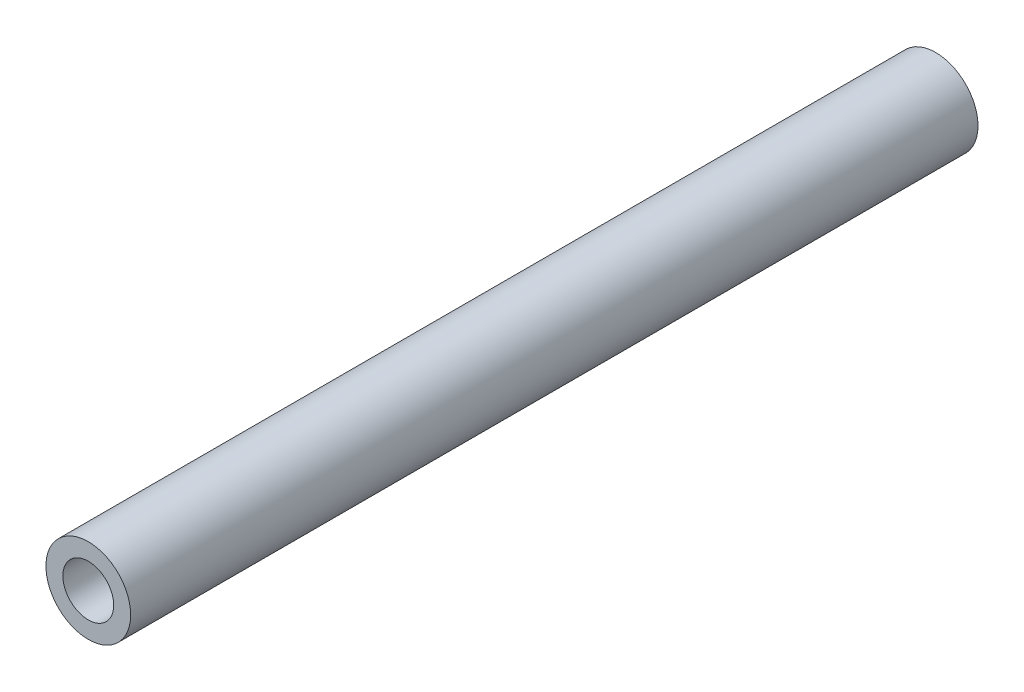
ISO-10303-21;
HEADER;
FILE_DESCRIPTION(('STEP AP214'),'2;1');
FILE_NAME('part.step','',(''),(''),'','','');
FILE_SCHEMA(('AUTOMOTIVE_DESIGN { 1 0 10303 214 1 1 1 1 }'));
ENDSEC;
DATA;
#1=APPLICATION_CONTEXT('core data for automotive mechanical design processes');
#2=APPLICATION_PROTOCOL_DEFINITION('international standard','automotive_design',2000,#1);
#3=PRODUCT_CONTEXT('',#1,'mechanical');
#4=PRODUCT('Part','Part','',(#3));
#5=PRODUCT_RELATED_PRODUCT_CATEGORY('part','',(#4));
#6=PRODUCT_DEFINITION_FORMATION('','',#4);
#7=PRODUCT_DEFINITION_CONTEXT('part definition',#1,'design');
#8=PRODUCT_DEFINITION('design','',#6,#7);
#9=PRODUCT_DEFINITION_SHAPE('','',#8);
#10=(LENGTH_UNIT() NAMED_UNIT(*) SI_UNIT(.MILLI.,.METRE.));
#11=(NAMED_UNIT(*) PLANE_ANGLE_UNIT() SI_UNIT($,.RADIAN.));
#12=(NAMED_UNIT(*) SI_UNIT($,.STERADIAN.) SOLID_ANGLE_UNIT());
#13=UNCERTAINTY_MEASURE_WITH_UNIT(LENGTH_MEASURE(1.E-05),#10,'distance_accuracy_value','');
#14=(GEOMETRIC_REPRESENTATION_CONTEXT(3) GLOBAL_UNCERTAINTY_ASSIGNED_CONTEXT((#13)) GLOBAL_UNIT_ASSIGNED_CONTEXT((#10,
#11,#12)) REPRESENTATION_CONTEXT('',''));
#15=CARTESIAN_POINT('',(0.,0.,0.));
#16=DIRECTION('',(0.,0.,1.));
#17=DIRECTION('',(1.,0.,0.));
#18=AXIS2_PLACEMENT_3D('',#15,#16,#17);
#19=CARTESIAN_POINT('',(0.,0.,50.));
#20=DIRECTION('',(0.,0.,-1.));
#21=DIRECTION('',(-1.,0.,0.));
#22=AXIS2_PLACEMENT_3D('',#19,#20,#21);
#23=CYLINDRICAL_SURFACE('',#22,2.5);
#24=CARTESIAN_POINT('',(0.,0.,50.));
#25=DIRECTION('',(0.,0.,1.));
#26=DIRECTION('',(1.,0.,0.));
#27=AXIS2_PLACEMENT_3D('',#24,#25,#26);
#28=CIRCLE('',#27,2.5);
#29=CARTESIAN_POINT('',(2.5,0.,50.));
#30=VERTEX_POINT('',#29);
#31=EDGE_CURVE('E10',#30,#30,#28,.T.);
#32=ORIENTED_EDGE('',*,*,#31,.F.);
#33=EDGE_LOOP('',(#32));
#34=FACE_BOUND('',#33,.T.);
#35=CARTESIAN_POINT('',(0.,0.,0.));
#36=DIRECTION('',(0.,0.,1.));
#37=DIRECTION('',(1.,0.,0.));
#38=AXIS2_PLACEMENT_3D('',#35,#36,#37);
#39=CIRCLE('',#38,2.5);
#40=CARTESIAN_POINT('',(2.5,0.,0.));
#41=VERTEX_POINT('',#40);
#42=EDGE_CURVE('E41',#41,#41,#39,.T.);
#43=ORIENTED_EDGE('',*,*,#42,.T.);
#44=EDGE_LOOP('',(#43));
#45=FACE_BOUND('',#44,.T.);
#46=ADVANCED_FACE('F38',(#34,#45),#23,.T.);
#47=CARTESIAN_POINT('',(0.,0.,50.));
#48=DIRECTION('',(0.,0.,1.));
#49=DIRECTION('',(1.,0.,0.));
#50=AXIS2_PLACEMENT_3D('',#47,#48,#49);
#51=PLANE('',#50);
#52=CARTESIAN_POINT('',(0.,0.,50.));
#53=DIRECTION('',(0.,0.,1.));
#54=DIRECTION('',(1.,0.,0.));
#55=AXIS2_PLACEMENT_3D('',#52,#53,#54);
#56=CIRCLE('',#55,1.5);
#57=CARTESIAN_POINT('',(1.5,0.,50.));
#58=VERTEX_POINT('',#57);
#59=EDGE_CURVE('E50',#58,#58,#56,.T.);
#60=ORIENTED_EDGE('',*,*,#59,.F.);
#61=EDGE_LOOP('',(#60));
#62=FACE_BOUND('',#61,.T.);
#63=ORIENTED_EDGE('',*,*,#31,.T.);
#64=EDGE_LOOP('',(#63));
#65=FACE_BOUND('',#64,.T.);
#66=ADVANCED_FACE('F75',(#62,#65),#51,.T.);
#67=CARTESIAN_POINT('',(0.,0.,0.));
#68=DIRECTION('',(0.,0.,1.));
#69=DIRECTION('',(1.,0.,0.));
#70=AXIS2_PLACEMENT_3D('',#67,#68,#69);
#71=PLANE('',#70);
#72=CARTESIAN_POINT('',(0.,0.,0.));
#73=DIRECTION('',(0.,0.,-1.));
#74=DIRECTION('',(-1.,0.,0.));
#75=AXIS2_PLACEMENT_3D('',#72,#73,#74);
#76=CIRCLE('',#75,1.5);
#77=CARTESIAN_POINT('',(-1.5,0.,0.));
#78=VERTEX_POINT('',#77);
#79=EDGE_CURVE('E56',#78,#78,#76,.T.);
#80=ORIENTED_EDGE('',*,*,#79,.F.);
#81=EDGE_LOOP('',(#80));
#82=FACE_BOUND('',#81,.T.);
#83=ORIENTED_EDGE('',*,*,#42,.F.);
#84=EDGE_LOOP('',(#83));
#85=FACE_BOUND('',#84,.T.);
#86=ADVANCED_FACE('F71',(#82,#85),#71,.F.);
#87=CARTESIAN_POINT('',(0.,0.,44.));
#88=DIRECTION('',(0.,0.,1.));
#89=DIRECTION('',(1.,0.,0.));
#90=AXIS2_PLACEMENT_3D('',#87,#88,#89);
#91=CYLINDRICAL_SURFACE('',#90,1.5);
#92=CARTESIAN_POINT('',(0.,0.,44.));
#93=DIRECTION('',(0.,0.,1.));
#94=DIRECTION('',(1.,0.,0.));
#95=AXIS2_PLACEMENT_3D('',#92,#93,#94);
#96=CIRCLE('',#95,1.5);
#97=CARTESIAN_POINT('',(1.5,0.,44.));
#98=VERTEX_POINT('',#97);
#99=EDGE_CURVE('E48',#98,#98,#96,.T.);
#100=ORIENTED_EDGE('',*,*,#99,.F.);
#101=EDGE_LOOP('',(#100));
#102=FACE_BOUND('',#101,.T.);
#103=ORIENTED_EDGE('',*,*,#59,.T.);
#104=EDGE_LOOP('',(#103));
#105=FACE_BOUND('',#104,.T.);
#106=ADVANCED_FACE('F74',(#102,#105),#91,.F.);
#107=CARTESIAN_POINT('',(0.,0.,44.));
#108=DIRECTION('',(0.,0.,1.));
#109=DIRECTION('',(1.,0.,0.));
#110=AXIS2_PLACEMENT_3D('',#107,#108,#109);
#111=PLANE('',#110);
#112=ORIENTED_EDGE('',*,*,#99,.T.);
#113=EDGE_LOOP('',(#112));
#114=FACE_BOUND('',#113,.T.);
#115=ADVANCED_FACE('F67',(#114),#111,.T.);
#116=CARTESIAN_POINT('',(0.,0.,6.));
#117=DIRECTION('',(0.,0.,-1.));
#118=DIRECTION('',(-1.,0.,0.));
#119=AXIS2_PLACEMENT_3D('',#116,#117,#118);
#120=CYLINDRICAL_SURFACE('',#119,1.5);
#121=CARTESIAN_POINT('',(0.,0.,6.));
#122=DIRECTION('',(0.,0.,-1.));
#123=DIRECTION('',(-1.,0.,0.));
#124=AXIS2_PLACEMENT_3D('',#121,#122,#123);
#125=CIRCLE('',#124,1.5);
#126=CARTESIAN_POINT('',(-1.5,0.,6.));
#127=VERTEX_POINT('',#126);
#128=EDGE_CURVE('E53',#127,#127,#125,.T.);
#129=ORIENTED_EDGE('',*,*,#128,.F.);
#130=EDGE_LOOP('',(#129));
#131=FACE_BOUND('',#130,.T.);
#132=ORIENTED_EDGE('',*,*,#79,.T.);
#133=EDGE_LOOP('',(#132));
#134=FACE_BOUND('',#133,.T.);
#135=ADVANCED_FACE('F64',(#131,#134),#120,.F.);
#136=CARTESIAN_POINT('',(0.,0.,6.));
#137=DIRECTION('',(0.,0.,-1.));
#138=DIRECTION('',(-1.,0.,0.));
#139=AXIS2_PLACEMENT_3D('',#136,#137,#138);
#140=PLANE('',#139);
#141=ORIENTED_EDGE('',*,*,#128,.T.);
#142=EDGE_LOOP('',(#141));
#143=FACE_BOUND('',#142,.T.);
#144=ADVANCED_FACE('F62',(#143),#140,.T.);
#145=CLOSED_SHELL('',(#46,#66,#86,#106,#115,#135,#144));
#146=MANIFOLD_SOLID_BREP('B2',#145);
#147=ADVANCED_BREP_SHAPE_REPRESENTATION('',(#18,#146),#14);
#148=SHAPE_DEFINITION_REPRESENTATION(#9,#147);
ENDSEC;
END-ISO-10303-21;
